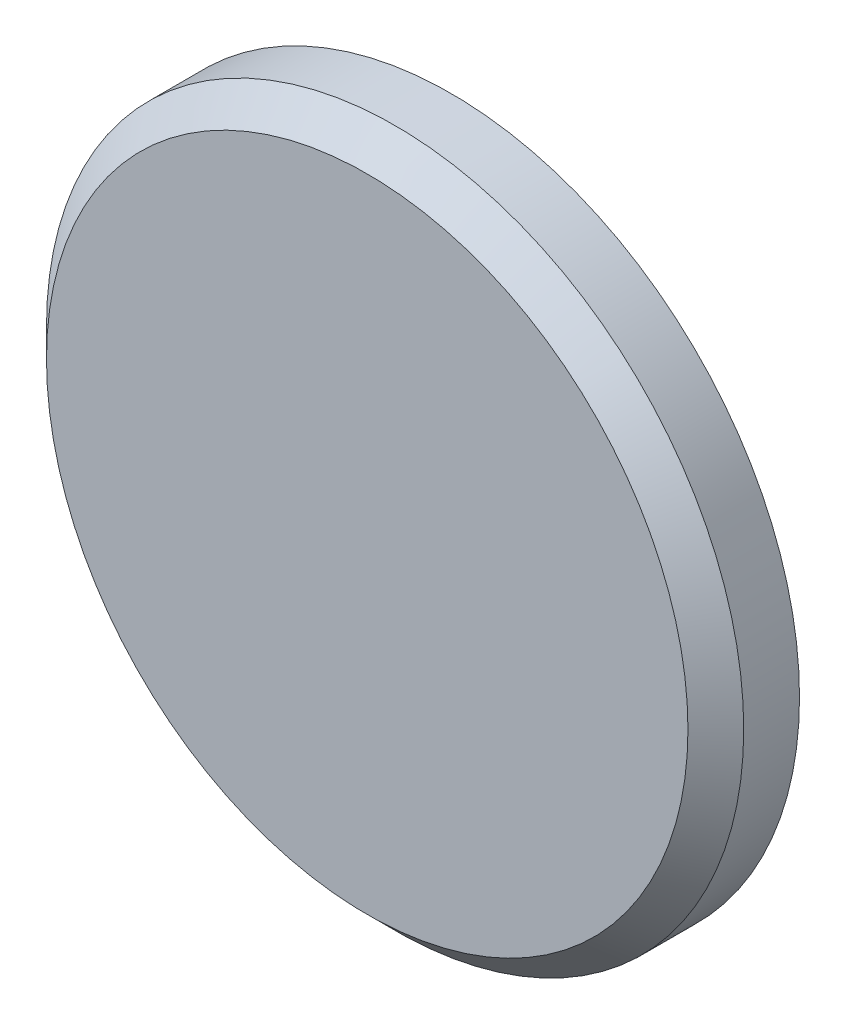
ISO-10303-21;
HEADER;
FILE_DESCRIPTION(('STEP AP214'),'2;1');
FILE_NAME('part.step','',(''),(''),'','','');
FILE_SCHEMA(('AUTOMOTIVE_DESIGN { 1 0 10303 214 1 1 1 1 }'));
ENDSEC;
DATA;
#1=APPLICATION_CONTEXT('core data for automotive mechanical design processes');
#2=APPLICATION_PROTOCOL_DEFINITION('international standard','automotive_design',2000,#1);
#3=PRODUCT_CONTEXT('',#1,'mechanical');
#4=PRODUCT('Part','Part','',(#3));
#5=PRODUCT_RELATED_PRODUCT_CATEGORY('part','',(#4));
#6=PRODUCT_DEFINITION_FORMATION('','',#4);
#7=PRODUCT_DEFINITION_CONTEXT('part definition',#1,'design');
#8=PRODUCT_DEFINITION('design','',#6,#7);
#9=PRODUCT_DEFINITION_SHAPE('','',#8);
#10=(LENGTH_UNIT() NAMED_UNIT(*) SI_UNIT(.MILLI.,.METRE.));
#11=(NAMED_UNIT(*) PLANE_ANGLE_UNIT() SI_UNIT($,.RADIAN.));
#12=(NAMED_UNIT(*) SI_UNIT($,.STERADIAN.) SOLID_ANGLE_UNIT());
#13=UNCERTAINTY_MEASURE_WITH_UNIT(LENGTH_MEASURE(1.E-05),#10,'distance_accuracy_value','');
#14=(GEOMETRIC_REPRESENTATION_CONTEXT(3) GLOBAL_UNCERTAINTY_ASSIGNED_CONTEXT((#13)) GLOBAL_UNIT_ASSIGNED_CONTEXT((#10,
#11,#12)) REPRESENTATION_CONTEXT('',''));
#15=CARTESIAN_POINT('',(0.,0.,0.));
#16=DIRECTION('',(0.,0.,1.));
#17=DIRECTION('',(1.,0.,0.));
#18=AXIS2_PLACEMENT_3D('',#15,#16,#17);
#19=CARTESIAN_POINT('',(132.424161543743,100.,3.));
#20=DIRECTION('',(0.,0.,-1.));
#21=DIRECTION('',(-1.,0.,0.));
#22=AXIS2_PLACEMENT_3D('',#19,#20,#21);
#23=CYLINDRICAL_SURFACE('',#22,12.5);
#24=CARTESIAN_POINT('',(132.424161543743,100.,2.));
#25=DIRECTION('',(0.,0.,1.));
#26=DIRECTION('',(1.,0.,0.));
#27=AXIS2_PLACEMENT_3D('',#24,#25,#26);
#28=CIRCLE('',#27,12.5);
#29=CARTESIAN_POINT('',(144.924161543743,100.,2.));
#30=VERTEX_POINT('',#29);
#31=EDGE_CURVE('E10',#30,#30,#28,.F.);
#32=ORIENTED_EDGE('',*,*,#31,.T.);
#33=EDGE_LOOP('',(#32));
#34=FACE_BOUND('',#33,.T.);
#35=CARTESIAN_POINT('',(132.424161543743,100.,0.));
#36=DIRECTION('',(0.,0.,1.));
#37=DIRECTION('',(1.,0.,0.));
#38=AXIS2_PLACEMENT_3D('',#35,#36,#37);
#39=CIRCLE('',#38,12.5);
#40=CARTESIAN_POINT('',(144.924161543743,100.,0.));
#41=VERTEX_POINT('',#40);
#42=EDGE_CURVE('E43',#41,#41,#39,.T.);
#43=ORIENTED_EDGE('',*,*,#42,.T.);
#44=EDGE_LOOP('',(#43));
#45=FACE_BOUND('',#44,.T.);
#46=ADVANCED_FACE('F32',(#34,#45),#23,.T.);
#47=CARTESIAN_POINT('',(132.424161543743,100.,3.));
#48=DIRECTION('',(0.,0.,1.));
#49=DIRECTION('',(1.,0.,0.));
#50=AXIS2_PLACEMENT_3D('',#47,#48,#49);
#51=PLANE('',#50);
#52=CARTESIAN_POINT('',(132.424161543743,100.,3.));
#53=DIRECTION('',(0.,0.,1.));
#54=DIRECTION('',(1.,0.,0.));
#55=AXIS2_PLACEMENT_3D('',#52,#53,#54);
#56=CIRCLE('',#55,11.5);
#57=CARTESIAN_POINT('',(143.924161543743,100.,3.));
#58=VERTEX_POINT('',#57);
#59=EDGE_CURVE('E39',#58,#58,#56,.T.);
#60=ORIENTED_EDGE('',*,*,#59,.T.);
#61=EDGE_LOOP('',(#60));
#62=FACE_BOUND('',#61,.T.);
#63=ADVANCED_FACE('F53',(#62),#51,.T.);
#64=CARTESIAN_POINT('',(132.424161543743,100.,0.));
#65=DIRECTION('',(0.,0.,1.));
#66=DIRECTION('',(1.,0.,0.));
#67=AXIS2_PLACEMENT_3D('',#64,#65,#66);
#68=PLANE('',#67);
#69=ORIENTED_EDGE('',*,*,#42,.F.);
#70=EDGE_LOOP('',(#69));
#71=FACE_BOUND('',#70,.T.);
#72=ADVANCED_FACE('F51',(#71),#68,.F.);
#73=CARTESIAN_POINT('',(132.424161543743,100.,3.));
#74=DIRECTION('',(0.,0.,-1.));
#75=DIRECTION('',(-1.,0.,0.));
#76=AXIS2_PLACEMENT_3D('',#73,#74,#75);
#77=CONICAL_SURFACE('',#76,11.5,0.785398163397448);
#78=ORIENTED_EDGE('',*,*,#31,.F.);
#79=EDGE_LOOP('',(#78));
#80=FACE_BOUND('',#79,.T.);
#81=ORIENTED_EDGE('',*,*,#59,.F.);
#82=EDGE_LOOP('',(#81));
#83=FACE_BOUND('',#82,.T.);
#84=ADVANCED_FACE('F34',(#80,#83),#77,.T.);
#85=CLOSED_SHELL('',(#46,#63,#72,#84));
#86=MANIFOLD_SOLID_BREP('B2',#85);
#87=ADVANCED_BREP_SHAPE_REPRESENTATION('',(#18,#86),#14);
#88=SHAPE_DEFINITION_REPRESENTATION(#9,#87);
ENDSEC;
END-ISO-10303-21;
